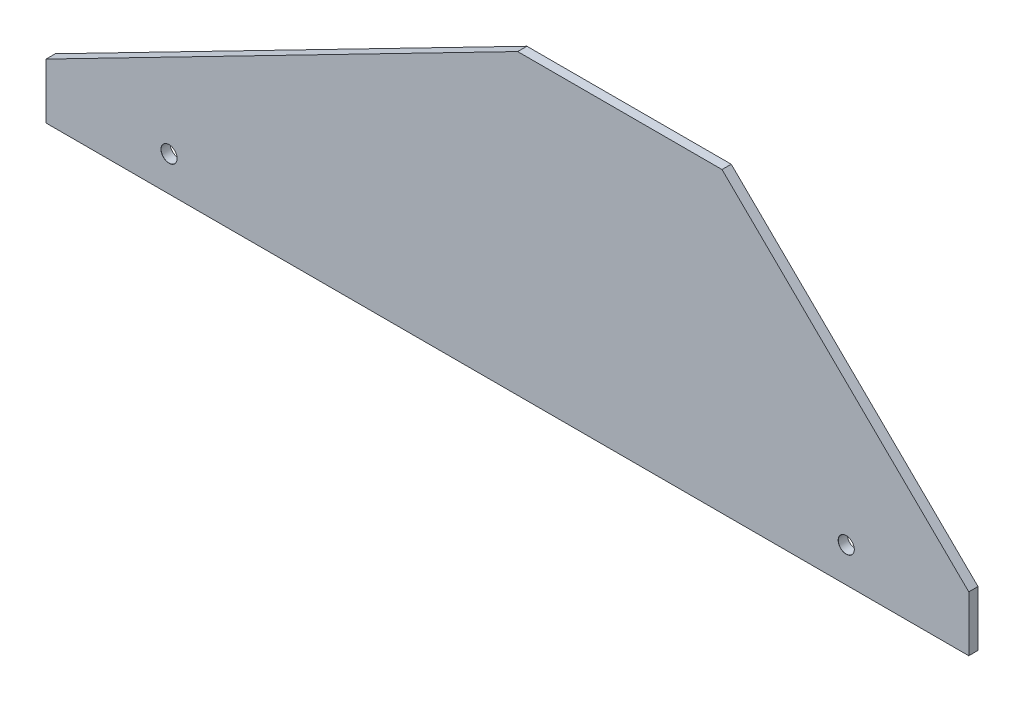
ISO-10303-21;
HEADER;
FILE_DESCRIPTION(('STEP AP214'),'2;1');
FILE_NAME('part.step','',(''),(''),'','','');
FILE_SCHEMA(('AUTOMOTIVE_DESIGN { 1 0 10303 214 1 1 1 1 }'));
ENDSEC;
DATA;
#1=APPLICATION_CONTEXT('core data for automotive mechanical design processes');
#2=APPLICATION_PROTOCOL_DEFINITION('international standard','automotive_design',2000,#1);
#3=PRODUCT_CONTEXT('',#1,'mechanical');
#4=PRODUCT('Part','Part','',(#3));
#5=PRODUCT_RELATED_PRODUCT_CATEGORY('part','',(#4));
#6=PRODUCT_DEFINITION_FORMATION('','',#4);
#7=PRODUCT_DEFINITION_CONTEXT('part definition',#1,'design');
#8=PRODUCT_DEFINITION('design','',#6,#7);
#9=PRODUCT_DEFINITION_SHAPE('','',#8);
#10=(LENGTH_UNIT() NAMED_UNIT(*) SI_UNIT(.MILLI.,.METRE.));
#11=(NAMED_UNIT(*) PLANE_ANGLE_UNIT() SI_UNIT($,.RADIAN.));
#12=(NAMED_UNIT(*) SI_UNIT($,.STERADIAN.) SOLID_ANGLE_UNIT());
#13=UNCERTAINTY_MEASURE_WITH_UNIT(LENGTH_MEASURE(1.E-05),#10,'distance_accuracy_value','');
#14=(GEOMETRIC_REPRESENTATION_CONTEXT(3) GLOBAL_UNCERTAINTY_ASSIGNED_CONTEXT((#13)) GLOBAL_UNIT_ASSIGNED_CONTEXT((#10,
#11,#12)) REPRESENTATION_CONTEXT('',''));
#15=CARTESIAN_POINT('',(0.,0.,0.));
#16=DIRECTION('',(0.,0.,1.));
#17=DIRECTION('',(1.,0.,0.));
#18=AXIS2_PLACEMENT_3D('',#15,#16,#17);
#19=CARTESIAN_POINT('',(150.,0.,3.));
#20=DIRECTION('',(1.,0.,0.));
#21=DIRECTION('',(0.,0.,-1.));
#22=AXIS2_PLACEMENT_3D('',#19,#20,#21);
#23=PLANE('',#22);
#24=DIRECTION('',(0.,-1.,0.));
#25=VECTOR('',#24,1.);
#26=CARTESIAN_POINT('',(150.,0.,0.));
#27=LINE('',#26,#25);
#28=CARTESIAN_POINT('',(150.,18.,0.));
#29=VERTEX_POINT('',#28);
#30=CARTESIAN_POINT('',(150.,0.,0.));
#31=VERTEX_POINT('',#30);
#32=EDGE_CURVE('E126',#29,#31,#27,.T.);
#33=ORIENTED_EDGE('',*,*,#32,.F.);
#34=DIRECTION('',(0.,0.,-1.));
#35=VECTOR('',#34,1.);
#36=CARTESIAN_POINT('',(150.,18.,3.));
#37=LINE('',#36,#35);
#38=CARTESIAN_POINT('',(150.,18.,3.));
#39=VERTEX_POINT('',#38);
#40=EDGE_CURVE('E11',#39,#29,#37,.T.);
#41=ORIENTED_EDGE('',*,*,#40,.F.);
#42=DIRECTION('',(0.,-1.,0.));
#43=VECTOR('',#42,1.);
#44=CARTESIAN_POINT('',(150.,0.,3.));
#45=LINE('',#44,#43);
#46=CARTESIAN_POINT('',(150.,0.,3.));
#47=VERTEX_POINT('',#46);
#48=EDGE_CURVE('E141',#39,#47,#45,.T.);
#49=ORIENTED_EDGE('',*,*,#48,.T.);
#50=DIRECTION('',(0.,0.,-1.));
#51=VECTOR('',#50,1.);
#52=CARTESIAN_POINT('',(150.,0.,3.));
#53=LINE('',#52,#51);
#54=EDGE_CURVE('E89',#47,#31,#53,.T.);
#55=ORIENTED_EDGE('',*,*,#54,.T.);
#56=EDGE_LOOP('',(#33,#41,#49,#55));
#57=FACE_BOUND('',#56,.T.);
#58=ADVANCED_FACE('F43',(#57),#23,.T.);
#59=CARTESIAN_POINT('',(82.6373986255995,84.150982310504,3.));
#60=DIRECTION('',(0.700661025336783,0.713494308017946,0.));
#61=DIRECTION('',(-0.713494308017946,0.700661025336783,0.));
#62=AXIS2_PLACEMENT_3D('',#59,#60,#61);
#63=PLANE('',#62);
#64=DIRECTION('',(0.713494308017946,-0.700661025336783,0.));
#65=VECTOR('',#64,1.);
#66=CARTESIAN_POINT('',(82.6373986255995,84.150982310504,0.));
#67=LINE('',#66,#65);
#68=CARTESIAN_POINT('',(69.7684177692834,96.7884949304352,0.));
#69=VERTEX_POINT('',#68);
#70=EDGE_CURVE('E129',#69,#29,#67,.T.);
#71=ORIENTED_EDGE('',*,*,#70,.F.);
#72=DIRECTION('',(0.,0.,-1.));
#73=VECTOR('',#72,1.);
#74=CARTESIAN_POINT('',(69.7684177692834,96.7884949304352,3.));
#75=LINE('',#74,#73);
#76=CARTESIAN_POINT('',(69.7684177692834,96.7884949304352,3.));
#77=VERTEX_POINT('',#76);
#78=EDGE_CURVE('E52',#77,#69,#75,.T.);
#79=ORIENTED_EDGE('',*,*,#78,.F.);
#80=DIRECTION('',(0.713494308017946,-0.700661025336783,0.));
#81=VECTOR('',#80,1.);
#82=CARTESIAN_POINT('',(82.6373986255995,84.150982310504,3.));
#83=LINE('',#82,#81);
#84=EDGE_CURVE('E159',#77,#39,#83,.T.);
#85=ORIENTED_EDGE('',*,*,#84,.T.);
#86=ORIENTED_EDGE('',*,*,#40,.T.);
#87=EDGE_LOOP('',(#71,#79,#85,#86));
#88=FACE_BOUND('',#87,.T.);
#89=ADVANCED_FACE('F169',(#88),#63,.T.);
#90=CARTESIAN_POINT('',(0.,96.7884949304352,3.));
#91=DIRECTION('',(0.,1.,0.));
#92=DIRECTION('',(0.,0.,1.));
#93=AXIS2_PLACEMENT_3D('',#90,#91,#92);
#94=PLANE('',#93);
#95=DIRECTION('',(1.,0.,0.));
#96=VECTOR('',#95,1.);
#97=CARTESIAN_POINT('',(0.,96.7884949304352,0.));
#98=LINE('',#97,#96);
#99=CARTESIAN_POINT('',(3.34266700308211,96.7884949304352,0.));
#100=VERTEX_POINT('',#99);
#101=EDGE_CURVE('E133',#100,#69,#98,.T.);
#102=ORIENTED_EDGE('',*,*,#101,.F.);
#103=DIRECTION('',(0.,0.,-1.));
#104=VECTOR('',#103,1.);
#105=CARTESIAN_POINT('',(3.34266700308211,96.7884949304352,3.));
#106=LINE('',#105,#104);
#107=CARTESIAN_POINT('',(3.34266700308211,96.7884949304352,3.));
#108=VERTEX_POINT('',#107);
#109=EDGE_CURVE('E112',#108,#100,#106,.T.);
#110=ORIENTED_EDGE('',*,*,#109,.F.);
#111=DIRECTION('',(1.,0.,0.));
#112=VECTOR('',#111,1.);
#113=CARTESIAN_POINT('',(0.,96.7884949304352,3.));
#114=LINE('',#113,#112);
#115=EDGE_CURVE('E119',#108,#77,#114,.T.);
#116=ORIENTED_EDGE('',*,*,#115,.T.);
#117=ORIENTED_EDGE('',*,*,#78,.T.);
#118=EDGE_LOOP('',(#102,#110,#116,#117));
#119=FACE_BOUND('',#118,.T.);
#120=ADVANCED_FACE('F163',(#119),#94,.T.);
#121=CARTESIAN_POINT('',(-38.6457493977714,75.2145638296467,3.));
#122=DIRECTION('',(-0.457011057975998,0.889461012573153,0.));
#123=DIRECTION('',(-0.889461012573153,-0.457011057975998,0.));
#124=AXIS2_PLACEMENT_3D('',#121,#122,#123);
#125=PLANE('',#124);
#126=DIRECTION('',(0.889461012573153,0.457011057975998,0.));
#127=VECTOR('',#126,1.);
#128=CARTESIAN_POINT('',(-38.6457493977714,75.2145638296467,0.));
#129=LINE('',#128,#127);
#130=CARTESIAN_POINT('',(-150.,18.,0.));
#131=VERTEX_POINT('',#130);
#132=EDGE_CURVE('E107',#131,#100,#129,.T.);
#133=ORIENTED_EDGE('',*,*,#132,.F.);
#134=DIRECTION('',(0.,0.,-1.));
#135=VECTOR('',#134,1.);
#136=CARTESIAN_POINT('',(-150.,18.,3.));
#137=LINE('',#136,#135);
#138=CARTESIAN_POINT('',(-150.,18.,3.));
#139=VERTEX_POINT('',#138);
#140=EDGE_CURVE('E102',#139,#131,#137,.T.);
#141=ORIENTED_EDGE('',*,*,#140,.F.);
#142=DIRECTION('',(0.889461012573153,0.457011057975998,0.));
#143=VECTOR('',#142,1.);
#144=CARTESIAN_POINT('',(-38.6457493977714,75.2145638296467,3.));
#145=LINE('',#144,#143);
#146=EDGE_CURVE('E105',#139,#108,#145,.T.);
#147=ORIENTED_EDGE('',*,*,#146,.T.);
#148=ORIENTED_EDGE('',*,*,#109,.T.);
#149=EDGE_LOOP('',(#133,#141,#147,#148));
#150=FACE_BOUND('',#149,.T.);
#151=ADVANCED_FACE('F104',(#150),#125,.T.);
#152=CARTESIAN_POINT('',(-150.,0.,3.));
#153=DIRECTION('',(-1.,0.,0.));
#154=DIRECTION('',(0.,0.,1.));
#155=AXIS2_PLACEMENT_3D('',#152,#153,#154);
#156=PLANE('',#155);
#157=DIRECTION('',(0.,1.,0.));
#158=VECTOR('',#157,1.);
#159=CARTESIAN_POINT('',(-150.,0.,0.));
#160=LINE('',#159,#158);
#161=CARTESIAN_POINT('',(-150.,0.,0.));
#162=VERTEX_POINT('',#161);
#163=EDGE_CURVE('E137',#162,#131,#160,.T.);
#164=ORIENTED_EDGE('',*,*,#163,.F.);
#165=DIRECTION('',(0.,0.,-1.));
#166=VECTOR('',#165,1.);
#167=CARTESIAN_POINT('',(-150.,0.,3.));
#168=LINE('',#167,#166);
#169=CARTESIAN_POINT('',(-150.,0.,3.));
#170=VERTEX_POINT('',#169);
#171=EDGE_CURVE('E82',#170,#162,#168,.T.);
#172=ORIENTED_EDGE('',*,*,#171,.F.);
#173=DIRECTION('',(0.,1.,0.));
#174=VECTOR('',#173,1.);
#175=CARTESIAN_POINT('',(-150.,0.,3.));
#176=LINE('',#175,#174);
#177=EDGE_CURVE('E116',#170,#139,#176,.T.);
#178=ORIENTED_EDGE('',*,*,#177,.T.);
#179=ORIENTED_EDGE('',*,*,#140,.T.);
#180=EDGE_LOOP('',(#164,#172,#178,#179));
#181=FACE_BOUND('',#180,.T.);
#182=ADVANCED_FACE('F121',(#181),#156,.T.);
#183=CARTESIAN_POINT('',(0.,0.,3.));
#184=DIRECTION('',(0.,1.,0.));
#185=DIRECTION('',(-1.,0.,0.));
#186=AXIS2_PLACEMENT_3D('',#183,#184,#185);
#187=PLANE('',#186);
#188=DIRECTION('',(1.,0.,0.));
#189=VECTOR('',#188,1.);
#190=CARTESIAN_POINT('',(0.,0.,0.));
#191=LINE('',#190,#189);
#192=EDGE_CURVE('E139',#162,#31,#191,.T.);
#193=ORIENTED_EDGE('',*,*,#192,.T.);
#194=ORIENTED_EDGE('',*,*,#54,.F.);
#195=DIRECTION('',(1.,0.,0.));
#196=VECTOR('',#195,1.);
#197=CARTESIAN_POINT('',(0.,0.,3.));
#198=LINE('',#197,#196);
#199=EDGE_CURVE('E61',#170,#47,#198,.T.);
#200=ORIENTED_EDGE('',*,*,#199,.F.);
#201=ORIENTED_EDGE('',*,*,#171,.T.);
#202=EDGE_LOOP('',(#193,#194,#200,#201));
#203=FACE_BOUND('',#202,.T.);
#204=ADVANCED_FACE('F167',(#203),#187,.F.);
#205=CARTESIAN_POINT('',(0.,0.,3.));
#206=DIRECTION('',(0.,0.,1.));
#207=DIRECTION('',(1.,0.,0.));
#208=AXIS2_PLACEMENT_3D('',#205,#206,#207);
#209=PLANE('',#208);
#210=CARTESIAN_POINT('',(-110.,11.3,3.));
#211=DIRECTION('',(0.,0.,1.));
#212=DIRECTION('',(1.,0.,0.));
#213=AXIS2_PLACEMENT_3D('',#210,#211,#212);
#214=CIRCLE('',#213,2.625);
#215=CARTESIAN_POINT('',(-107.375,11.3,3.));
#216=VERTEX_POINT('',#215);
#217=EDGE_CURVE('E211',#216,#216,#214,.T.);
#218=ORIENTED_EDGE('',*,*,#217,.F.);
#219=EDGE_LOOP('',(#218));
#220=FACE_BOUND('',#219,.T.);
#221=CARTESIAN_POINT('',(110.16,11.3,3.));
#222=DIRECTION('',(0.,0.,1.));
#223=DIRECTION('',(1.,0.,0.));
#224=AXIS2_PLACEMENT_3D('',#221,#222,#223);
#225=CIRCLE('',#224,2.625);
#226=CARTESIAN_POINT('',(112.785,11.3,3.));
#227=VERTEX_POINT('',#226);
#228=EDGE_CURVE('E150',#227,#227,#225,.T.);
#229=ORIENTED_EDGE('',*,*,#228,.F.);
#230=EDGE_LOOP('',(#229));
#231=FACE_BOUND('',#230,.T.);
#232=ORIENTED_EDGE('',*,*,#48,.F.);
#233=ORIENTED_EDGE('',*,*,#84,.F.);
#234=ORIENTED_EDGE('',*,*,#115,.F.);
#235=ORIENTED_EDGE('',*,*,#146,.F.);
#236=ORIENTED_EDGE('',*,*,#177,.F.);
#237=ORIENTED_EDGE('',*,*,#199,.T.);
#238=EDGE_LOOP('',(#232,#233,#234,#235,#236,#237));
#239=FACE_BOUND('',#238,.T.);
#240=ADVANCED_FACE('F115',(#220,#231,#239),#209,.T.);
#241=CARTESIAN_POINT('',(0.,0.,0.));
#242=DIRECTION('',(0.,0.,1.));
#243=DIRECTION('',(1.,0.,0.));
#244=AXIS2_PLACEMENT_3D('',#241,#242,#243);
#245=PLANE('',#244);
#246=CARTESIAN_POINT('',(-110.,11.3,0.));
#247=DIRECTION('',(0.,0.,1.));
#248=DIRECTION('',(1.,0.,0.));
#249=AXIS2_PLACEMENT_3D('',#246,#247,#248);
#250=CIRCLE('',#249,2.59999999999999);
#251=CARTESIAN_POINT('',(-107.4,11.3,0.));
#252=VERTEX_POINT('',#251);
#253=EDGE_CURVE('E46',#252,#252,#250,.T.);
#254=ORIENTED_EDGE('',*,*,#253,.T.);
#255=EDGE_LOOP('',(#254));
#256=FACE_BOUND('',#255,.T.);
#257=CARTESIAN_POINT('',(110.16,11.3,0.));
#258=DIRECTION('',(0.,0.,1.));
#259=DIRECTION('',(1.,0.,0.));
#260=AXIS2_PLACEMENT_3D('',#257,#258,#259);
#261=CIRCLE('',#260,2.6);
#262=CARTESIAN_POINT('',(112.76,11.3,0.));
#263=VERTEX_POINT('',#262);
#264=EDGE_CURVE('E130',#263,#263,#261,.T.);
#265=ORIENTED_EDGE('',*,*,#264,.T.);
#266=EDGE_LOOP('',(#265));
#267=FACE_BOUND('',#266,.T.);
#268=ORIENTED_EDGE('',*,*,#32,.T.);
#269=ORIENTED_EDGE('',*,*,#192,.F.);
#270=ORIENTED_EDGE('',*,*,#163,.T.);
#271=ORIENTED_EDGE('',*,*,#132,.T.);
#272=ORIENTED_EDGE('',*,*,#101,.T.);
#273=ORIENTED_EDGE('',*,*,#70,.T.);
#274=EDGE_LOOP('',(#268,#269,#270,#271,#272,#273));
#275=FACE_BOUND('',#274,.T.);
#276=ADVANCED_FACE('F166',(#256,#267,#275),#245,.F.);
#277=CARTESIAN_POINT('',(110.16,11.3,3.));
#278=DIRECTION('',(0.,0.,1.));
#279=DIRECTION('',(1.,0.,0.));
#280=AXIS2_PLACEMENT_3D('',#277,#278,#279);
#281=CYLINDRICAL_SURFACE('',#280,2.6);
#282=CARTESIAN_POINT('',(110.16,11.3,2.975));
#283=DIRECTION('',(0.,0.,1.));
#284=DIRECTION('',(1.,0.,0.));
#285=AXIS2_PLACEMENT_3D('',#282,#283,#284);
#286=CIRCLE('',#285,2.6);
#287=CARTESIAN_POINT('',(112.76,11.3,2.975));
#288=VERTEX_POINT('',#287);
#289=EDGE_CURVE('E146',#288,#288,#286,.T.);
#290=ORIENTED_EDGE('',*,*,#289,.T.);
#291=EDGE_LOOP('',(#290));
#292=FACE_BOUND('',#291,.T.);
#293=ORIENTED_EDGE('',*,*,#264,.F.);
#294=EDGE_LOOP('',(#293));
#295=FACE_BOUND('',#294,.T.);
#296=ADVANCED_FACE('F185',(#292,#295),#281,.F.);
#297=CARTESIAN_POINT('',(110.16,11.3,3.));
#298=DIRECTION('',(0.,0.,1.));
#299=DIRECTION('',(1.,0.,0.));
#300=AXIS2_PLACEMENT_3D('',#297,#298,#299);
#301=CONICAL_SURFACE('',#300,2.625,0.785398163397275);
#302=ORIENTED_EDGE('',*,*,#289,.F.);
#303=EDGE_LOOP('',(#302));
#304=FACE_BOUND('',#303,.T.);
#305=ORIENTED_EDGE('',*,*,#228,.T.);
#306=EDGE_LOOP('',(#305));
#307=FACE_BOUND('',#306,.T.);
#308=ADVANCED_FACE('F192',(#304,#307),#301,.F.);
#309=CARTESIAN_POINT('',(-110.,11.3,3.));
#310=DIRECTION('',(0.,0.,1.));
#311=DIRECTION('',(1.,0.,0.));
#312=AXIS2_PLACEMENT_3D('',#309,#310,#311);
#313=CYLINDRICAL_SURFACE('',#312,2.59999999999999);
#314=CARTESIAN_POINT('',(-110.,11.3,2.975));
#315=DIRECTION('',(0.,0.,1.));
#316=DIRECTION('',(1.,0.,0.));
#317=AXIS2_PLACEMENT_3D('',#314,#315,#316);
#318=CIRCLE('',#317,2.59999999999999);
#319=CARTESIAN_POINT('',(-107.4,11.3,2.975));
#320=VERTEX_POINT('',#319);
#321=EDGE_CURVE('E208',#320,#320,#318,.T.);
#322=ORIENTED_EDGE('',*,*,#321,.T.);
#323=EDGE_LOOP('',(#322));
#324=FACE_BOUND('',#323,.T.);
#325=ORIENTED_EDGE('',*,*,#253,.F.);
#326=EDGE_LOOP('',(#325));
#327=FACE_BOUND('',#326,.T.);
#328=ADVANCED_FACE('F195',(#324,#327),#313,.F.);
#329=CARTESIAN_POINT('',(-110.,11.3,3.));
#330=DIRECTION('',(0.,0.,1.));
#331=DIRECTION('',(1.,0.,0.));
#332=AXIS2_PLACEMENT_3D('',#329,#330,#331);
#333=CONICAL_SURFACE('',#332,2.625,0.785398163397552);
#334=ORIENTED_EDGE('',*,*,#321,.F.);
#335=EDGE_LOOP('',(#334));
#336=FACE_BOUND('',#335,.T.);
#337=ORIENTED_EDGE('',*,*,#217,.T.);
#338=EDGE_LOOP('',(#337));
#339=FACE_BOUND('',#338,.T.);
#340=ADVANCED_FACE('F199',(#336,#339),#333,.F.);
#341=CLOSED_SHELL('',(#58,#89,#120,#151,#182,#204,#240,#276,#296,#308,#328,#340));
#342=MANIFOLD_SOLID_BREP('B2',#341);
#343=ADVANCED_BREP_SHAPE_REPRESENTATION('',(#18,#342),#14);
#344=SHAPE_DEFINITION_REPRESENTATION(#9,#343);
ENDSEC;
END-ISO-10303-21;
